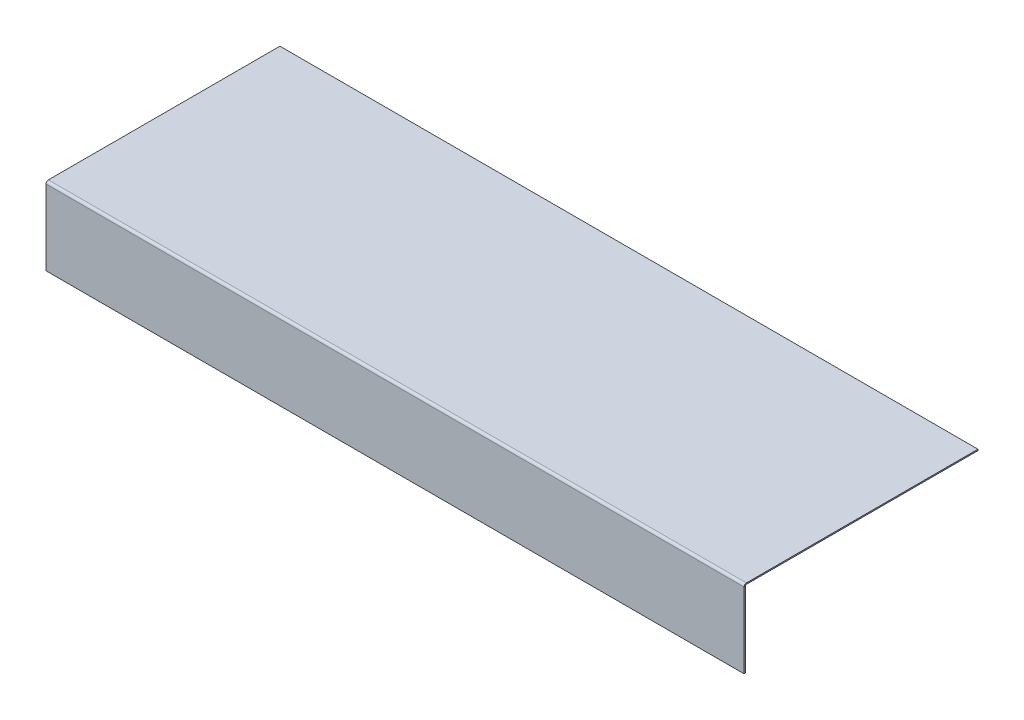
ISO-10303-21;
HEADER;
FILE_DESCRIPTION(('STEP AP214'),'2;1');
FILE_NAME('part.step','',(''),(''),'','','');
FILE_SCHEMA(('AUTOMOTIVE_DESIGN { 1 0 10303 214 1 1 1 1 }'));
ENDSEC;
DATA;
#1=APPLICATION_CONTEXT('core data for automotive mechanical design processes');
#2=APPLICATION_PROTOCOL_DEFINITION('international standard','automotive_design',2000,#1);
#3=PRODUCT_CONTEXT('',#1,'mechanical');
#4=PRODUCT('Part','Part','',(#3));
#5=PRODUCT_RELATED_PRODUCT_CATEGORY('part','',(#4));
#6=PRODUCT_DEFINITION_FORMATION('','',#4);
#7=PRODUCT_DEFINITION_CONTEXT('part definition',#1,'design');
#8=PRODUCT_DEFINITION('design','',#6,#7);
#9=PRODUCT_DEFINITION_SHAPE('','',#8);
#10=(LENGTH_UNIT() NAMED_UNIT(*) SI_UNIT(.MILLI.,.METRE.));
#11=(NAMED_UNIT(*) PLANE_ANGLE_UNIT() SI_UNIT($,.RADIAN.));
#12=(NAMED_UNIT(*) SI_UNIT($,.STERADIAN.) SOLID_ANGLE_UNIT());
#13=UNCERTAINTY_MEASURE_WITH_UNIT(LENGTH_MEASURE(1.E-05),#10,'distance_accuracy_value','');
#14=(GEOMETRIC_REPRESENTATION_CONTEXT(3) GLOBAL_UNCERTAINTY_ASSIGNED_CONTEXT((#13)) GLOBAL_UNIT_ASSIGNED_CONTEXT((#10,
#11,#12)) REPRESENTATION_CONTEXT('',''));
#15=CARTESIAN_POINT('',(0.,0.,0.));
#16=DIRECTION('',(0.,0.,1.));
#17=DIRECTION('',(1.,0.,0.));
#18=AXIS2_PLACEMENT_3D('',#15,#16,#17);
#19=CARTESIAN_POINT('',(-228.6,-0.8128,0.));
#20=DIRECTION('',(-1.,0.,0.));
#21=DIRECTION('',(0.,0.,1.));
#22=AXIS2_PLACEMENT_3D('',#19,#20,#21);
#23=PLANE('',#22);
#24=DIRECTION('',(0.,0.,1.));
#25=VECTOR('',#24,1.);
#26=CARTESIAN_POINT('',(-228.6,-0.8128,0.));
#27=LINE('',#26,#25);
#28=CARTESIAN_POINT('',(-228.6,-0.8128,0.));
#29=VERTEX_POINT('',#28);
#30=CARTESIAN_POINT('',(-228.6,-0.812800000000002,151.6634));
#31=VERTEX_POINT('',#30);
#32=EDGE_CURVE('E88',#29,#31,#27,.T.);
#33=ORIENTED_EDGE('',*,*,#32,.T.);
#34=DIRECTION('',(0.,1.,0.));
#35=VECTOR('',#34,1.);
#36=CARTESIAN_POINT('',(-228.6,-0.812800000000002,151.6634));
#37=LINE('',#36,#35);
#38=CARTESIAN_POINT('',(-228.6,0.,151.6634));
#39=VERTEX_POINT('',#38);
#40=EDGE_CURVE('E79',#31,#39,#37,.T.);
#41=ORIENTED_EDGE('',*,*,#40,.T.);
#42=DIRECTION('',(0.,0.,1.));
#43=VECTOR('',#42,1.);
#44=CARTESIAN_POINT('',(-228.6,0.,0.));
#45=LINE('',#44,#43);
#46=CARTESIAN_POINT('',(-228.6,0.,0.));
#47=VERTEX_POINT('',#46);
#48=EDGE_CURVE('E77',#47,#39,#45,.T.);
#49=ORIENTED_EDGE('',*,*,#48,.F.);
#50=DIRECTION('',(0.,1.,0.));
#51=VECTOR('',#50,1.);
#52=CARTESIAN_POINT('',(-228.6,-0.8128,0.));
#53=LINE('',#52,#51);
#54=EDGE_CURVE('E11',#29,#47,#53,.T.);
#55=ORIENTED_EDGE('',*,*,#54,.F.);
#56=EDGE_LOOP('',(#33,#41,#49,#55));
#57=FACE_BOUND('',#56,.T.);
#58=ADVANCED_FACE('F35',(#57),#23,.T.);
#59=CARTESIAN_POINT('',(0.,-0.8128,0.));
#60=DIRECTION('',(0.,1.,0.));
#61=DIRECTION('',(0.,0.,1.));
#62=AXIS2_PLACEMENT_3D('',#59,#60,#61);
#63=PLANE('',#62);
#64=DIRECTION('',(-1.,0.,0.));
#65=VECTOR('',#64,1.);
#66=CARTESIAN_POINT('',(-228.6,-0.812800000000002,151.6634));
#67=LINE('',#66,#65);
#68=CARTESIAN_POINT('',(228.6,-0.812800000000002,151.6634));
#69=VERTEX_POINT('',#68);
#70=EDGE_CURVE('E101',#31,#69,#67,.F.);
#71=ORIENTED_EDGE('',*,*,#70,.F.);
#72=ORIENTED_EDGE('',*,*,#32,.F.);
#73=DIRECTION('',(-1.,0.,0.));
#74=VECTOR('',#73,1.);
#75=CARTESIAN_POINT('',(-228.6,-0.8128,0.));
#76=LINE('',#75,#74);
#77=CARTESIAN_POINT('',(228.6,-0.8128,0.));
#78=VERTEX_POINT('',#77);
#79=EDGE_CURVE('E74',#78,#29,#76,.T.);
#80=ORIENTED_EDGE('',*,*,#79,.F.);
#81=DIRECTION('',(0.,0.,-1.));
#82=VECTOR('',#81,1.);
#83=CARTESIAN_POINT('',(228.6,-0.8128,0.));
#84=LINE('',#83,#82);
#85=EDGE_CURVE('E90',#69,#78,#84,.T.);
#86=ORIENTED_EDGE('',*,*,#85,.F.);
#87=EDGE_LOOP('',(#71,#72,#80,#86));
#88=FACE_BOUND('',#87,.T.);
#89=ADVANCED_FACE('F202',(#88),#63,.F.);
#90=CARTESIAN_POINT('',(0.,0.,0.));
#91=DIRECTION('',(0.,1.,0.));
#92=DIRECTION('',(0.,0.,1.));
#93=AXIS2_PLACEMENT_3D('',#90,#91,#92);
#94=PLANE('',#93);
#95=ORIENTED_EDGE('',*,*,#48,.T.);
#96=DIRECTION('',(-1.,0.,0.));
#97=VECTOR('',#96,1.);
#98=CARTESIAN_POINT('',(-228.6,0.,151.6634));
#99=LINE('',#98,#97);
#100=CARTESIAN_POINT('',(228.6,0.,151.6634));
#101=VERTEX_POINT('',#100);
#102=EDGE_CURVE('E111',#39,#101,#99,.F.);
#103=ORIENTED_EDGE('',*,*,#102,.T.);
#104=DIRECTION('',(0.,0.,-1.));
#105=VECTOR('',#104,1.);
#106=CARTESIAN_POINT('',(228.6,0.,0.));
#107=LINE('',#106,#105);
#108=CARTESIAN_POINT('',(228.6,0.,0.));
#109=VERTEX_POINT('',#108);
#110=EDGE_CURVE('E82',#101,#109,#107,.T.);
#111=ORIENTED_EDGE('',*,*,#110,.T.);
#112=DIRECTION('',(-1.,0.,0.));
#113=VECTOR('',#112,1.);
#114=CARTESIAN_POINT('',(-228.6,0.,0.));
#115=LINE('',#114,#113);
#116=EDGE_CURVE('E72',#109,#47,#115,.T.);
#117=ORIENTED_EDGE('',*,*,#116,.T.);
#118=EDGE_LOOP('',(#95,#103,#111,#117));
#119=FACE_BOUND('',#118,.T.);
#120=ADVANCED_FACE('F85',(#119),#94,.T.);
#121=CARTESIAN_POINT('',(-228.6,-0.8128,0.));
#122=DIRECTION('',(0.,0.,-1.));
#123=DIRECTION('',(-1.,0.,0.));
#124=AXIS2_PLACEMENT_3D('',#121,#122,#123);
#125=PLANE('',#124);
#126=ORIENTED_EDGE('',*,*,#116,.F.);
#127=DIRECTION('',(0.,1.,0.));
#128=VECTOR('',#127,1.);
#129=CARTESIAN_POINT('',(228.6,-0.8128,0.));
#130=LINE('',#129,#128);
#131=EDGE_CURVE('E38',#78,#109,#130,.T.);
#132=ORIENTED_EDGE('',*,*,#131,.F.);
#133=ORIENTED_EDGE('',*,*,#79,.T.);
#134=ORIENTED_EDGE('',*,*,#54,.T.);
#135=EDGE_LOOP('',(#126,#132,#133,#134));
#136=FACE_BOUND('',#135,.T.);
#137=ADVANCED_FACE('F69',(#136),#125,.T.);
#138=CARTESIAN_POINT('',(228.6,-0.8128,0.));
#139=DIRECTION('',(1.,0.,0.));
#140=DIRECTION('',(0.,0.,-1.));
#141=AXIS2_PLACEMENT_3D('',#138,#139,#140);
#142=PLANE('',#141);
#143=DIRECTION('',(0.,1.,0.));
#144=VECTOR('',#143,1.);
#145=CARTESIAN_POINT('',(228.6,-0.812800000000002,151.6634));
#146=LINE('',#145,#144);
#147=EDGE_CURVE('E83',#69,#101,#146,.T.);
#148=ORIENTED_EDGE('',*,*,#147,.F.);
#149=ORIENTED_EDGE('',*,*,#85,.T.);
#150=ORIENTED_EDGE('',*,*,#131,.T.);
#151=ORIENTED_EDGE('',*,*,#110,.F.);
#152=EDGE_LOOP('',(#148,#149,#150,#151));
#153=FACE_BOUND('',#152,.T.);
#154=ADVANCED_FACE('F200',(#153),#142,.T.);
#155=CARTESIAN_POINT('',(228.6,-1.54940000000001,151.6634));
#156=DIRECTION('',(1.,0.,0.));
#157=DIRECTION('',(0.,0.,-1.));
#158=AXIS2_PLACEMENT_3D('',#155,#156,#157);
#159=PLANE('',#158);
#160=DIRECTION('',(0.,0.,1.));
#161=VECTOR('',#160,1.);
#162=CARTESIAN_POINT('',(228.6,-1.54940000000001,152.4));
#163=LINE('',#162,#161);
#164=CARTESIAN_POINT('',(228.6,-1.5494,152.4));
#165=VERTEX_POINT('',#164);
#166=CARTESIAN_POINT('',(228.6,-1.5494,153.2128));
#167=VERTEX_POINT('',#166);
#168=EDGE_CURVE('E140',#165,#167,#163,.T.);
#169=ORIENTED_EDGE('',*,*,#168,.F.);
#170=CARTESIAN_POINT('',(228.6,-1.54940000000001,151.6634));
#171=DIRECTION('',(-1.,0.,0.));
#172=DIRECTION('',(0.,0.,1.));
#173=AXIS2_PLACEMENT_3D('',#170,#171,#172);
#174=CIRCLE('',#173,0.736600000000004);
#175=EDGE_CURVE('E105',#69,#165,#174,.F.);
#176=ORIENTED_EDGE('',*,*,#175,.F.);
#177=ORIENTED_EDGE('',*,*,#147,.T.);
#178=CARTESIAN_POINT('',(228.6,-1.54940000000001,151.6634));
#179=DIRECTION('',(-1.,0.,0.));
#180=DIRECTION('',(0.,0.,1.));
#181=AXIS2_PLACEMENT_3D('',#178,#179,#180);
#182=CIRCLE('',#181,1.5494);
#183=EDGE_CURVE('E49',#101,#167,#182,.F.);
#184=ORIENTED_EDGE('',*,*,#183,.T.);
#185=EDGE_LOOP('',(#169,#176,#177,#184));
#186=FACE_BOUND('',#185,.T.);
#187=ADVANCED_FACE('F196',(#186),#159,.T.);
#188=CARTESIAN_POINT('',(-228.6,-1.54940000000001,151.6634));
#189=DIRECTION('',(1.,0.,0.));
#190=DIRECTION('',(0.,0.,-1.));
#191=AXIS2_PLACEMENT_3D('',#188,#189,#190);
#192=PLANE('',#191);
#193=CARTESIAN_POINT('',(-228.6,-1.54940000000001,151.6634));
#194=DIRECTION('',(-1.,0.,0.));
#195=DIRECTION('',(0.,0.,1.));
#196=AXIS2_PLACEMENT_3D('',#193,#194,#195);
#197=CIRCLE('',#196,0.736600000000004);
#198=CARTESIAN_POINT('',(-228.6,-1.5494,152.4));
#199=VERTEX_POINT('',#198);
#200=EDGE_CURVE('E98',#199,#31,#197,.T.);
#201=ORIENTED_EDGE('',*,*,#200,.F.);
#202=DIRECTION('',(0.,0.,1.));
#203=VECTOR('',#202,1.);
#204=CARTESIAN_POINT('',(-228.6,-1.54940000000001,152.4));
#205=LINE('',#204,#203);
#206=CARTESIAN_POINT('',(-228.6,-1.54940000000001,153.2128));
#207=VERTEX_POINT('',#206);
#208=EDGE_CURVE('E139',#199,#207,#205,.T.);
#209=ORIENTED_EDGE('',*,*,#208,.T.);
#210=CARTESIAN_POINT('',(-228.6,-1.54940000000001,151.6634));
#211=DIRECTION('',(-1.,0.,0.));
#212=DIRECTION('',(0.,0.,1.));
#213=AXIS2_PLACEMENT_3D('',#210,#211,#212);
#214=CIRCLE('',#213,1.5494);
#215=EDGE_CURVE('E108',#207,#39,#214,.T.);
#216=ORIENTED_EDGE('',*,*,#215,.T.);
#217=ORIENTED_EDGE('',*,*,#40,.F.);
#218=EDGE_LOOP('',(#201,#209,#216,#217));
#219=FACE_BOUND('',#218,.T.);
#220=ADVANCED_FACE('F161',(#219),#192,.F.);
#221=CARTESIAN_POINT('',(-228.6,-1.54940000000001,151.6634));
#222=DIRECTION('',(-1.,0.,0.));
#223=DIRECTION('',(0.,0.,1.));
#224=AXIS2_PLACEMENT_3D('',#221,#222,#223);
#225=CYLINDRICAL_SURFACE('',#224,1.5494);
#226=ORIENTED_EDGE('',*,*,#102,.F.);
#227=ORIENTED_EDGE('',*,*,#215,.F.);
#228=DIRECTION('',(1.,0.,0.));
#229=VECTOR('',#228,1.);
#230=CARTESIAN_POINT('',(0.,-1.54940000000001,153.2128));
#231=LINE('',#230,#229);
#232=EDGE_CURVE('E130',#207,#167,#231,.T.);
#233=ORIENTED_EDGE('',*,*,#232,.T.);
#234=ORIENTED_EDGE('',*,*,#183,.F.);
#235=EDGE_LOOP('',(#226,#227,#233,#234));
#236=FACE_BOUND('',#235,.T.);
#237=ADVANCED_FACE('F221',(#236),#225,.T.);
#238=CARTESIAN_POINT('',(-228.6,-1.54940000000001,151.6634));
#239=DIRECTION('',(-1.,0.,0.));
#240=DIRECTION('',(0.,0.,1.));
#241=AXIS2_PLACEMENT_3D('',#238,#239,#240);
#242=CYLINDRICAL_SURFACE('',#241,0.736600000000004);
#243=ORIENTED_EDGE('',*,*,#70,.T.);
#244=ORIENTED_EDGE('',*,*,#175,.T.);
#245=DIRECTION('',(-1.,0.,0.));
#246=VECTOR('',#245,1.);
#247=CARTESIAN_POINT('',(228.6,-1.54940000000001,152.4));
#248=LINE('',#247,#246);
#249=EDGE_CURVE('E143',#165,#199,#248,.T.);
#250=ORIENTED_EDGE('',*,*,#249,.T.);
#251=ORIENTED_EDGE('',*,*,#200,.T.);
#252=EDGE_LOOP('',(#243,#244,#250,#251));
#253=FACE_BOUND('',#252,.T.);
#254=ADVANCED_FACE('F151',(#253),#242,.F.);
#255=CARTESIAN_POINT('',(-228.6,-50.8,153.2128));
#256=DIRECTION('',(1.,0.,0.));
#257=DIRECTION('',(0.,0.,-1.));
#258=AXIS2_PLACEMENT_3D('',#255,#256,#257);
#259=PLANE('',#258);
#260=ORIENTED_EDGE('',*,*,#208,.F.);
#261=DIRECTION('',(0.,-1.,0.));
#262=VECTOR('',#261,1.);
#263=CARTESIAN_POINT('',(-228.6,-50.8,152.4));
#264=LINE('',#263,#262);
#265=CARTESIAN_POINT('',(-228.6,-50.8,152.4));
#266=VERTEX_POINT('',#265);
#267=EDGE_CURVE('E127',#199,#266,#264,.T.);
#268=ORIENTED_EDGE('',*,*,#267,.T.);
#269=DIRECTION('',(0.,0.,-1.));
#270=VECTOR('',#269,1.);
#271=CARTESIAN_POINT('',(-228.6,-50.8,153.2128));
#272=LINE('',#271,#270);
#273=CARTESIAN_POINT('',(-228.6,-50.8,153.2128));
#274=VERTEX_POINT('',#273);
#275=EDGE_CURVE('E102',#274,#266,#272,.T.);
#276=ORIENTED_EDGE('',*,*,#275,.F.);
#277=DIRECTION('',(0.,-1.,0.));
#278=VECTOR('',#277,1.);
#279=CARTESIAN_POINT('',(-228.6,-50.8,153.2128));
#280=LINE('',#279,#278);
#281=EDGE_CURVE('E123',#207,#274,#280,.T.);
#282=ORIENTED_EDGE('',*,*,#281,.F.);
#283=EDGE_LOOP('',(#260,#268,#276,#282));
#284=FACE_BOUND('',#283,.T.);
#285=ADVANCED_FACE('F166',(#284),#259,.F.);
#286=CARTESIAN_POINT('',(228.6,-0.812799999999997,153.2128));
#287=DIRECTION('',(-1.,0.,0.));
#288=DIRECTION('',(0.,-1.,0.));
#289=AXIS2_PLACEMENT_3D('',#286,#287,#288);
#290=PLANE('',#289);
#291=ORIENTED_EDGE('',*,*,#168,.T.);
#292=DIRECTION('',(0.,1.,0.));
#293=VECTOR('',#292,1.);
#294=CARTESIAN_POINT('',(228.6,-0.812799999999997,153.2128));
#295=LINE('',#294,#293);
#296=CARTESIAN_POINT('',(228.6,-50.8,153.2128));
#297=VERTEX_POINT('',#296);
#298=EDGE_CURVE('E119',#297,#167,#295,.T.);
#299=ORIENTED_EDGE('',*,*,#298,.F.);
#300=DIRECTION('',(0.,0.,-1.));
#301=VECTOR('',#300,1.);
#302=CARTESIAN_POINT('',(228.6,-50.8,153.2128));
#303=LINE('',#302,#301);
#304=CARTESIAN_POINT('',(228.6,-50.8,152.4));
#305=VERTEX_POINT('',#304);
#306=EDGE_CURVE('E116',#297,#305,#303,.T.);
#307=ORIENTED_EDGE('',*,*,#306,.T.);
#308=DIRECTION('',(0.,1.,0.));
#309=VECTOR('',#308,1.);
#310=CARTESIAN_POINT('',(228.6,-0.8128,152.4));
#311=LINE('',#310,#309);
#312=EDGE_CURVE('E120',#305,#165,#311,.T.);
#313=ORIENTED_EDGE('',*,*,#312,.T.);
#314=EDGE_LOOP('',(#291,#299,#307,#313));
#315=FACE_BOUND('',#314,.T.);
#316=ADVANCED_FACE('F182',(#315),#290,.F.);
#317=CARTESIAN_POINT('',(0.,5.10561820220545E-13,153.2128));
#318=DIRECTION('',(0.,0.,-1.));
#319=DIRECTION('',(0.,1.,0.));
#320=AXIS2_PLACEMENT_3D('',#317,#318,#319);
#321=PLANE('',#320);
#322=ORIENTED_EDGE('',*,*,#232,.F.);
#323=ORIENTED_EDGE('',*,*,#281,.T.);
#324=DIRECTION('',(1.,0.,0.));
#325=VECTOR('',#324,1.);
#326=CARTESIAN_POINT('',(228.6,-50.8,153.2128));
#327=LINE('',#326,#325);
#328=EDGE_CURVE('E133',#274,#297,#327,.T.);
#329=ORIENTED_EDGE('',*,*,#328,.T.);
#330=ORIENTED_EDGE('',*,*,#298,.T.);
#331=EDGE_LOOP('',(#322,#323,#329,#330));
#332=FACE_BOUND('',#331,.T.);
#333=ADVANCED_FACE('F187',(#332),#321,.F.);
#334=CARTESIAN_POINT('',(0.,5.07723944188334E-13,152.4));
#335=DIRECTION('',(0.,0.,-1.));
#336=DIRECTION('',(0.,1.,0.));
#337=AXIS2_PLACEMENT_3D('',#334,#335,#336);
#338=PLANE('',#337);
#339=ORIENTED_EDGE('',*,*,#267,.F.);
#340=ORIENTED_EDGE('',*,*,#249,.F.);
#341=ORIENTED_EDGE('',*,*,#312,.F.);
#342=DIRECTION('',(1.,0.,0.));
#343=VECTOR('',#342,1.);
#344=CARTESIAN_POINT('',(228.6,-50.8,152.4));
#345=LINE('',#344,#343);
#346=EDGE_CURVE('E124',#266,#305,#345,.T.);
#347=ORIENTED_EDGE('',*,*,#346,.F.);
#348=EDGE_LOOP('',(#339,#340,#341,#347));
#349=FACE_BOUND('',#348,.T.);
#350=ADVANCED_FACE('F170',(#349),#338,.T.);
#351=CARTESIAN_POINT('',(228.6,-50.8,153.2128));
#352=DIRECTION('',(0.,1.,0.));
#353=DIRECTION('',(0.,0.,1.));
#354=AXIS2_PLACEMENT_3D('',#351,#352,#353);
#355=PLANE('',#354);
#356=ORIENTED_EDGE('',*,*,#346,.T.);
#357=ORIENTED_EDGE('',*,*,#306,.F.);
#358=ORIENTED_EDGE('',*,*,#328,.F.);
#359=ORIENTED_EDGE('',*,*,#275,.T.);
#360=EDGE_LOOP('',(#356,#357,#358,#359));
#361=FACE_BOUND('',#360,.T.);
#362=ADVANCED_FACE('F175',(#361),#355,.F.);
#363=CLOSED_SHELL('',(#58,#89,#120,#137,#154,#187,#220,#237,#254,#285,#316,#333,#350,#362));
#364=MANIFOLD_SOLID_BREP('B2',#363);
#365=ADVANCED_BREP_SHAPE_REPRESENTATION('',(#18,#364),#14);
#366=SHAPE_DEFINITION_REPRESENTATION(#9,#365);
ENDSEC;
END-ISO-10303-21;
